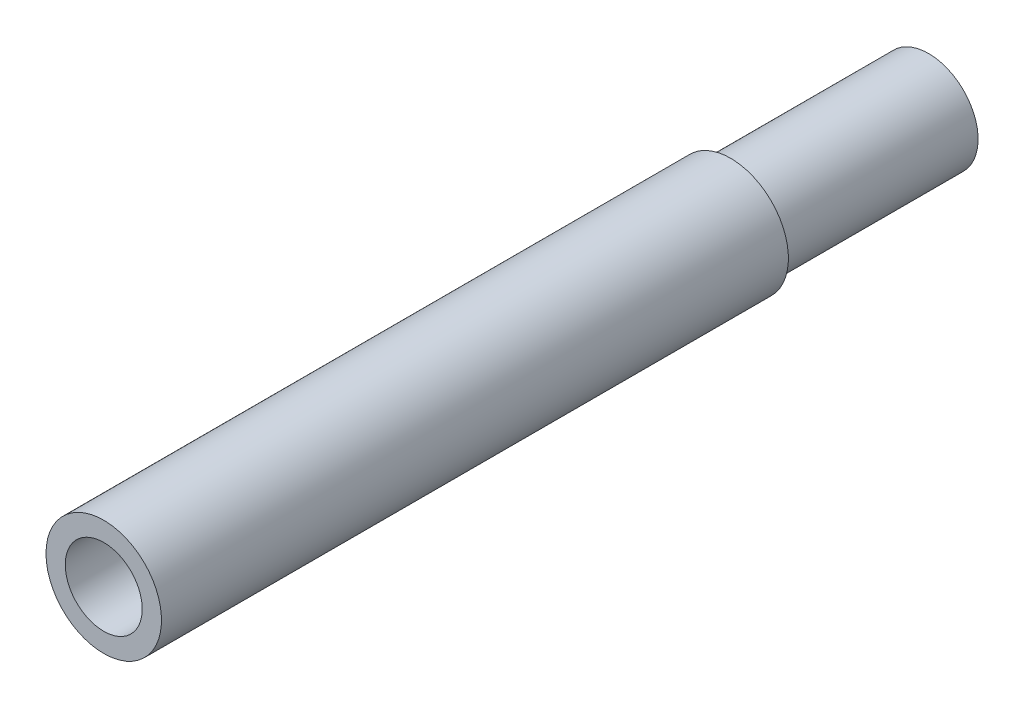
ISO-10303-21;
HEADER;
FILE_DESCRIPTION(('STEP AP214'),'2;1');
FILE_NAME('part.step','',(''),(''),'','','');
FILE_SCHEMA(('AUTOMOTIVE_DESIGN { 1 0 10303 214 1 1 1 1 }'));
ENDSEC;
DATA;
#1=APPLICATION_CONTEXT('core data for automotive mechanical design processes');
#2=APPLICATION_PROTOCOL_DEFINITION('international standard','automotive_design',2000,#1);
#3=PRODUCT_CONTEXT('',#1,'mechanical');
#4=PRODUCT('Part','Part','',(#3));
#5=PRODUCT_RELATED_PRODUCT_CATEGORY('part','',(#4));
#6=PRODUCT_DEFINITION_FORMATION('','',#4);
#7=PRODUCT_DEFINITION_CONTEXT('part definition',#1,'design');
#8=PRODUCT_DEFINITION('design','',#6,#7);
#9=PRODUCT_DEFINITION_SHAPE('','',#8);
#10=(LENGTH_UNIT() NAMED_UNIT(*) SI_UNIT(.MILLI.,.METRE.));
#11=(NAMED_UNIT(*) PLANE_ANGLE_UNIT() SI_UNIT($,.RADIAN.));
#12=(NAMED_UNIT(*) SI_UNIT($,.STERADIAN.) SOLID_ANGLE_UNIT());
#13=UNCERTAINTY_MEASURE_WITH_UNIT(LENGTH_MEASURE(1.E-05),#10,'distance_accuracy_value','');
#14=(GEOMETRIC_REPRESENTATION_CONTEXT(3) GLOBAL_UNCERTAINTY_ASSIGNED_CONTEXT((#13)) GLOBAL_UNIT_ASSIGNED_CONTEXT((#10,
#11,#12)) REPRESENTATION_CONTEXT('',''));
#15=CARTESIAN_POINT('',(0.,0.,0.));
#16=DIRECTION('',(0.,0.,1.));
#17=DIRECTION('',(1.,0.,0.));
#18=AXIS2_PLACEMENT_3D('',#15,#16,#17);
#19=CARTESIAN_POINT('',(0.,0.,114.));
#20=DIRECTION('',(0.,0.,1.));
#21=DIRECTION('',(1.,0.,0.));
#22=AXIS2_PLACEMENT_3D('',#19,#20,#21);
#23=PLANE('',#22);
#24=CARTESIAN_POINT('',(0.,0.,114.));
#25=DIRECTION('',(0.,0.,1.));
#26=DIRECTION('',(1.,0.,0.));
#27=AXIS2_PLACEMENT_3D('',#24,#25,#26);
#28=CIRCLE('',#27,10.5);
#29=CARTESIAN_POINT('',(-10.5,0.,114.));
#30=VERTEX_POINT('',#29);
#31=EDGE_CURVE('E44',#30,#30,#28,.T.);
#32=ORIENTED_EDGE('',*,*,#31,.T.);
#33=EDGE_LOOP('',(#32));
#34=FACE_BOUND('',#33,.T.);
#35=CARTESIAN_POINT('',(0.,0.,114.));
#36=DIRECTION('',(0.,0.,1.));
#37=DIRECTION('',(1.,0.,0.));
#38=AXIS2_PLACEMENT_3D('',#35,#36,#37);
#39=CIRCLE('',#38,7.);
#40=CARTESIAN_POINT('',(-7.,0.,114.));
#41=VERTEX_POINT('',#40);
#42=EDGE_CURVE('E53',#41,#41,#39,.T.);
#43=ORIENTED_EDGE('',*,*,#42,.F.);
#44=EDGE_LOOP('',(#43));
#45=FACE_BOUND('',#44,.T.);
#46=ADVANCED_FACE('F40',(#34,#45),#23,.T.);
#47=CARTESIAN_POINT('',(0.,0.,0.));
#48=DIRECTION('',(0.,0.,1.));
#49=DIRECTION('',(1.,0.,0.));
#50=AXIS2_PLACEMENT_3D('',#47,#48,#49);
#51=PLANE('',#50);
#52=CARTESIAN_POINT('',(0.,0.,0.));
#53=DIRECTION('',(0.,0.,-1.));
#54=DIRECTION('',(-1.,0.,0.));
#55=AXIS2_PLACEMENT_3D('',#52,#53,#54);
#56=CIRCLE('',#55,9.);
#57=CARTESIAN_POINT('',(-9.,0.,0.));
#58=VERTEX_POINT('',#57);
#59=EDGE_CURVE('E10',#58,#58,#56,.T.);
#60=ORIENTED_EDGE('',*,*,#59,.F.);
#61=EDGE_LOOP('',(#60));
#62=FACE_BOUND('',#61,.T.);
#63=CARTESIAN_POINT('',(0.,0.,0.));
#64=DIRECTION('',(0.,0.,1.));
#65=DIRECTION('',(1.,0.,0.));
#66=AXIS2_PLACEMENT_3D('',#63,#64,#65);
#67=CIRCLE('',#66,10.5);
#68=CARTESIAN_POINT('',(-10.5,0.,0.));
#69=VERTEX_POINT('',#68);
#70=EDGE_CURVE('E41',#69,#69,#67,.T.);
#71=ORIENTED_EDGE('',*,*,#70,.F.);
#72=EDGE_LOOP('',(#71));
#73=FACE_BOUND('',#72,.T.);
#74=ADVANCED_FACE('F76',(#62,#73),#51,.F.);
#75=CARTESIAN_POINT('',(0.,0.,114.));
#76=DIRECTION('',(0.,0.,-1.));
#77=DIRECTION('',(-1.,0.,0.));
#78=AXIS2_PLACEMENT_3D('',#75,#76,#77);
#79=CYLINDRICAL_SURFACE('',#78,10.5);
#80=CARTESIAN_POINT('',(-10.5,0.,114.));
#81=CARTESIAN_POINT('',(-10.5,0.,112.8125));
#82=CARTESIAN_POINT('',(-10.5,0.,111.625));
#83=CARTESIAN_POINT('',(-10.5,0.,109.25));
#84=CARTESIAN_POINT('',(-10.5,0.,108.0625));
#85=CARTESIAN_POINT('',(-10.5,0.,105.6875));
#86=CARTESIAN_POINT('',(-10.5,0.,104.5));
#87=CARTESIAN_POINT('',(-10.5,0.,102.125));
#88=CARTESIAN_POINT('',(-10.5,0.,100.9375));
#89=CARTESIAN_POINT('',(-10.5,0.,98.5625));
#90=CARTESIAN_POINT('',(-10.5,0.,97.375));
#91=CARTESIAN_POINT('',(-10.5,0.,95.));
#92=CARTESIAN_POINT('',(-10.5,0.,93.8125));
#93=CARTESIAN_POINT('',(-10.5,0.,91.4375));
#94=CARTESIAN_POINT('',(-10.5,0.,90.25));
#95=CARTESIAN_POINT('',(-10.5,0.,87.875));
#96=CARTESIAN_POINT('',(-10.5,0.,86.6875));
#97=CARTESIAN_POINT('',(-10.5,0.,84.3125));
#98=CARTESIAN_POINT('',(-10.5,0.,83.125));
#99=CARTESIAN_POINT('',(-10.5,0.,80.75));
#100=CARTESIAN_POINT('',(-10.5,0.,79.5625));
#101=CARTESIAN_POINT('',(-10.5,0.,77.1875));
#102=CARTESIAN_POINT('',(-10.5,0.,76.));
#103=CARTESIAN_POINT('',(-10.5,0.,73.625));
#104=CARTESIAN_POINT('',(-10.5,0.,72.4375));
#105=CARTESIAN_POINT('',(-10.5,0.,70.0625));
#106=CARTESIAN_POINT('',(-10.5,0.,68.875));
#107=CARTESIAN_POINT('',(-10.5,0.,66.5));
#108=CARTESIAN_POINT('',(-10.5,0.,65.3125));
#109=CARTESIAN_POINT('',(-10.5,0.,62.9375));
#110=CARTESIAN_POINT('',(-10.5,0.,61.75));
#111=CARTESIAN_POINT('',(-10.5,0.,59.375));
#112=CARTESIAN_POINT('',(-10.5,0.,58.1875));
#113=CARTESIAN_POINT('',(-10.5,0.,55.8125));
#114=CARTESIAN_POINT('',(-10.5,0.,54.625));
#115=CARTESIAN_POINT('',(-10.5,0.,52.25));
#116=CARTESIAN_POINT('',(-10.5,0.,51.0625));
#117=CARTESIAN_POINT('',(-10.5,0.,48.6875));
#118=CARTESIAN_POINT('',(-10.5,0.,47.5));
#119=CARTESIAN_POINT('',(-10.5,0.,45.125));
#120=CARTESIAN_POINT('',(-10.5,0.,43.9375));
#121=CARTESIAN_POINT('',(-10.5,0.,41.5625));
#122=CARTESIAN_POINT('',(-10.5,0.,40.375));
#123=CARTESIAN_POINT('',(-10.5,0.,38.));
#124=CARTESIAN_POINT('',(-10.5,0.,36.8125));
#125=CARTESIAN_POINT('',(-10.5,0.,34.4375));
#126=CARTESIAN_POINT('',(-10.5,0.,33.25));
#127=CARTESIAN_POINT('',(-10.5,0.,30.875));
#128=CARTESIAN_POINT('',(-10.5,0.,29.6875));
#129=CARTESIAN_POINT('',(-10.5,0.,27.3125));
#130=CARTESIAN_POINT('',(-10.5,0.,26.125));
#131=CARTESIAN_POINT('',(-10.5,0.,23.75));
#132=CARTESIAN_POINT('',(-10.5,0.,22.5625));
#133=CARTESIAN_POINT('',(-10.5,0.,20.1875));
#134=CARTESIAN_POINT('',(-10.5,0.,19.));
#135=CARTESIAN_POINT('',(-10.5,0.,16.625));
#136=CARTESIAN_POINT('',(-10.5,0.,15.4375));
#137=CARTESIAN_POINT('',(-10.5,0.,13.0625));
#138=CARTESIAN_POINT('',(-10.5,0.,11.875));
#139=CARTESIAN_POINT('',(-10.5,0.,9.5));
#140=CARTESIAN_POINT('',(-10.5,0.,8.31250000000001));
#141=CARTESIAN_POINT('',(-10.5,0.,5.9375));
#142=CARTESIAN_POINT('',(-10.5,0.,4.75));
#143=CARTESIAN_POINT('',(-10.5,0.,2.375));
#144=CARTESIAN_POINT('',(-10.5,0.,1.1875));
#145=CARTESIAN_POINT('',(-10.5,0.,0.));
#146=B_SPLINE_CURVE_WITH_KNOTS('',3,(#80,#81,#82,#83,#84,#85,#86,#87,#88,#89,#90,#91,#92,#93,
#94,#95,#96,#97,#98,#99,#100,#101,#102,#103,#104,#105,#106,#107,#108,#109,#110,#111,#112,#113,
#114,#115,#116,#117,#118,#119,#120,#121,#122,#123,#124,#125,#126,#127,#128,#129,#130,#131,#132,
#133,#134,#135,#136,#137,#138,#139,#140,#141,#142,#143,#144,#145),.UNSPECIFIED.,.F.,.F.,(4,2,2,
2,2,2,2,2,2,2,2,2,2,2,2,2,2,2,2,2,2,2,2,2,2,2,2,2,2,2,2,2,4),(0.,3.5625,7.12499999999999,
10.6875,14.25,17.8125,21.375,24.9375,28.5,32.0625,35.625,39.1875,42.75,46.3125,49.875,53.4375,
57.,60.5625,64.125,67.6875,71.25,74.8125,78.375,81.9375,85.5,89.0625,92.625,96.1875,99.75,
103.3125,106.875,110.4375,114.),.UNSPECIFIED.);
#147=EDGE_CURVE('BSEAM39',#30,#69,#146,.T.);
#148=ORIENTED_EDGE('',*,*,#31,.F.);
#149=ORIENTED_EDGE('',*,*,#70,.T.);
#150=ORIENTED_EDGE('',*,*,#147,.T.);
#151=ORIENTED_EDGE('',*,*,#147,.F.);
#152=EDGE_LOOP('',(#148,#150,#149,#151));
#153=FACE_BOUND('',#152,.T.);
#154=ADVANCED_FACE('F39',(#153),#79,.T.);
#155=CARTESIAN_POINT('',(0.,0.,114.));
#156=DIRECTION('',(0.,0.,-1.));
#157=DIRECTION('',(-1.,0.,0.));
#158=AXIS2_PLACEMENT_3D('',#155,#156,#157);
#159=CYLINDRICAL_SURFACE('',#158,7.);
#160=CARTESIAN_POINT('',(0.,0.,-36.));
#161=DIRECTION('',(0.,0.,-1.));
#162=DIRECTION('',(-1.,0.,0.));
#163=AXIS2_PLACEMENT_3D('',#160,#161,#162);
#164=CIRCLE('',#163,7.);
#165=CARTESIAN_POINT('',(-7.,0.,-36.));
#166=VERTEX_POINT('',#165);
#167=EDGE_CURVE('E58',#166,#166,#164,.T.);
#168=CARTESIAN_POINT('',(-7.,0.,114.));
#169=CARTESIAN_POINT('',(-7.,0.,112.4375));
#170=CARTESIAN_POINT('',(-7.,0.,110.875));
#171=CARTESIAN_POINT('',(-7.,0.,107.75));
#172=CARTESIAN_POINT('',(-7.,0.,106.1875));
#173=CARTESIAN_POINT('',(-7.,0.,103.0625));
#174=CARTESIAN_POINT('',(-7.,0.,101.5));
#175=CARTESIAN_POINT('',(-7.,0.,98.375));
#176=CARTESIAN_POINT('',(-7.,0.,96.8125));
#177=CARTESIAN_POINT('',(-7.,0.,93.6875));
#178=CARTESIAN_POINT('',(-7.,0.,92.125));
#179=CARTESIAN_POINT('',(-7.,0.,89.));
#180=CARTESIAN_POINT('',(-7.,0.,87.4375));
#181=CARTESIAN_POINT('',(-7.,0.,84.3125));
#182=CARTESIAN_POINT('',(-7.,0.,82.75));
#183=CARTESIAN_POINT('',(-7.,0.,79.625));
#184=CARTESIAN_POINT('',(-7.,0.,78.0625));
#185=CARTESIAN_POINT('',(-7.,0.,74.9375));
#186=CARTESIAN_POINT('',(-7.,0.,73.375));
#187=CARTESIAN_POINT('',(-7.,0.,70.25));
#188=CARTESIAN_POINT('',(-7.,0.,68.6875));
#189=CARTESIAN_POINT('',(-7.,0.,65.5625));
#190=CARTESIAN_POINT('',(-7.,0.,64.));
#191=CARTESIAN_POINT('',(-7.,0.,60.875));
#192=CARTESIAN_POINT('',(-7.,0.,59.3125));
#193=CARTESIAN_POINT('',(-7.,0.,56.1875));
#194=CARTESIAN_POINT('',(-7.,0.,54.625));
#195=CARTESIAN_POINT('',(-7.,0.,51.5));
#196=CARTESIAN_POINT('',(-7.,0.,49.9375));
#197=CARTESIAN_POINT('',(-7.,0.,46.8125));
#198=CARTESIAN_POINT('',(-7.,0.,45.25));
#199=CARTESIAN_POINT('',(-7.,0.,42.125));
#200=CARTESIAN_POINT('',(-7.,0.,40.5625));
#201=CARTESIAN_POINT('',(-7.,0.,37.4375));
#202=CARTESIAN_POINT('',(-7.,0.,35.875));
#203=CARTESIAN_POINT('',(-7.,0.,32.75));
#204=CARTESIAN_POINT('',(-7.,0.,31.1875));
#205=CARTESIAN_POINT('',(-7.,0.,28.0625));
#206=CARTESIAN_POINT('',(-7.,0.,26.5));
#207=CARTESIAN_POINT('',(-7.,0.,23.375));
#208=CARTESIAN_POINT('',(-7.,0.,21.8125));
#209=CARTESIAN_POINT('',(-7.,0.,18.6875));
#210=CARTESIAN_POINT('',(-7.,0.,17.125));
#211=CARTESIAN_POINT('',(-7.,0.,14.));
#212=CARTESIAN_POINT('',(-7.,0.,12.4375));
#213=CARTESIAN_POINT('',(-7.,0.,9.3125));
#214=CARTESIAN_POINT('',(-7.,0.,7.75));
#215=CARTESIAN_POINT('',(-7.,0.,4.625));
#216=CARTESIAN_POINT('',(-7.,0.,3.0625));
#217=CARTESIAN_POINT('',(-7.,0.,-0.0624999999999977));
#218=CARTESIAN_POINT('',(-7.,0.,-1.625));
#219=CARTESIAN_POINT('',(-7.,0.,-4.74999999999999));
#220=CARTESIAN_POINT('',(-7.,0.,-6.31249999999999));
#221=CARTESIAN_POINT('',(-7.,0.,-9.43749999999999));
#222=CARTESIAN_POINT('',(-7.,0.,-11.));
#223=CARTESIAN_POINT('',(-7.,0.,-14.125));
#224=CARTESIAN_POINT('',(-7.,0.,-15.6875));
#225=CARTESIAN_POINT('',(-7.,0.,-18.8125));
#226=CARTESIAN_POINT('',(-7.,0.,-20.375));
#227=CARTESIAN_POINT('',(-7.,0.,-23.5));
#228=CARTESIAN_POINT('',(-7.,0.,-25.0625));
#229=CARTESIAN_POINT('',(-7.,0.,-28.1875));
#230=CARTESIAN_POINT('',(-7.,0.,-29.75));
#231=CARTESIAN_POINT('',(-7.,0.,-32.875));
#232=CARTESIAN_POINT('',(-7.,0.,-34.4375));
#233=CARTESIAN_POINT('',(-7.,0.,-36.));
#234=B_SPLINE_CURVE_WITH_KNOTS('',3,(#168,#169,#170,#171,#172,#173,#174,#175,#176,#177,#178,
#179,#180,#181,#182,#183,#184,#185,#186,#187,#188,#189,#190,#191,#192,#193,#194,#195,#196,#197,
#198,#199,#200,#201,#202,#203,#204,#205,#206,#207,#208,#209,#210,#211,#212,#213,#214,#215,#216,
#217,#218,#219,#220,#221,#222,#223,#224,#225,#226,#227,#228,#229,#230,#231,#232,#233),
.UNSPECIFIED.,.F.,.F.,(4,2,2,2,2,2,2,2,2,2,2,2,2,2,2,2,2,2,2,2,2,2,2,2,2,2,2,2,2,2,2,2,4),(0.,
4.68750000000001,9.37500000000001,14.0625,18.75,23.4375,28.125,32.8125,37.5,42.1875,46.875,
51.5625,56.25,60.9375,65.625,70.3125,75.,79.6875,84.375,89.0625,93.75,98.4375,103.125,107.8125,
112.5,117.1875,121.875,126.5625,131.25,135.9375,140.625,145.3125,150.),.UNSPECIFIED.);
#235=EDGE_CURVE('BSEAM67',#41,#166,#234,.T.);
#236=ORIENTED_EDGE('',*,*,#42,.T.);
#237=ORIENTED_EDGE('',*,*,#167,.T.);
#238=ORIENTED_EDGE('',*,*,#235,.T.);
#239=ORIENTED_EDGE('',*,*,#235,.F.);
#240=EDGE_LOOP('',(#236,#238,#237,#239));
#241=FACE_BOUND('',#240,.T.);
#242=ADVANCED_FACE('F67',(#241),#159,.F.);
#243=CARTESIAN_POINT('',(0.,0.,-36.));
#244=DIRECTION('',(0.,0.,-1.));
#245=DIRECTION('',(-1.,0.,0.));
#246=AXIS2_PLACEMENT_3D('',#243,#244,#245);
#247=PLANE('',#246);
#248=CARTESIAN_POINT('',(0.,0.,-36.));
#249=DIRECTION('',(0.,0.,-1.));
#250=DIRECTION('',(-1.,0.,0.));
#251=AXIS2_PLACEMENT_3D('',#248,#249,#250);
#252=CIRCLE('',#251,9.);
#253=CARTESIAN_POINT('',(-9.,0.,-36.));
#254=VERTEX_POINT('',#253);
#255=EDGE_CURVE('E55',#254,#254,#252,.T.);
#256=ORIENTED_EDGE('',*,*,#255,.T.);
#257=EDGE_LOOP('',(#256));
#258=FACE_BOUND('',#257,.T.);
#259=ORIENTED_EDGE('',*,*,#167,.F.);
#260=EDGE_LOOP('',(#259));
#261=FACE_BOUND('',#260,.T.);
#262=ADVANCED_FACE('F68',(#258,#261),#247,.T.);
#263=CARTESIAN_POINT('',(0.,0.,-36.));
#264=DIRECTION('',(0.,0.,1.));
#265=DIRECTION('',(1.,0.,0.));
#266=AXIS2_PLACEMENT_3D('',#263,#264,#265);
#267=CYLINDRICAL_SURFACE('',#266,9.);
#268=ORIENTED_EDGE('',*,*,#255,.F.);
#269=EDGE_LOOP('',(#268));
#270=FACE_BOUND('',#269,.T.);
#271=ORIENTED_EDGE('',*,*,#59,.T.);
#272=EDGE_LOOP('',(#271));
#273=FACE_BOUND('',#272,.T.);
#274=ADVANCED_FACE('F66',(#270,#273),#267,.T.);
#275=CLOSED_SHELL('',(#46,#74,#154,#242,#262,#274));
#276=MANIFOLD_SOLID_BREP('B2',#275);
#277=ADVANCED_BREP_SHAPE_REPRESENTATION('',(#18,#276),#14);
#278=SHAPE_DEFINITION_REPRESENTATION(#9,#277);
ENDSEC;
END-ISO-10303-21;
